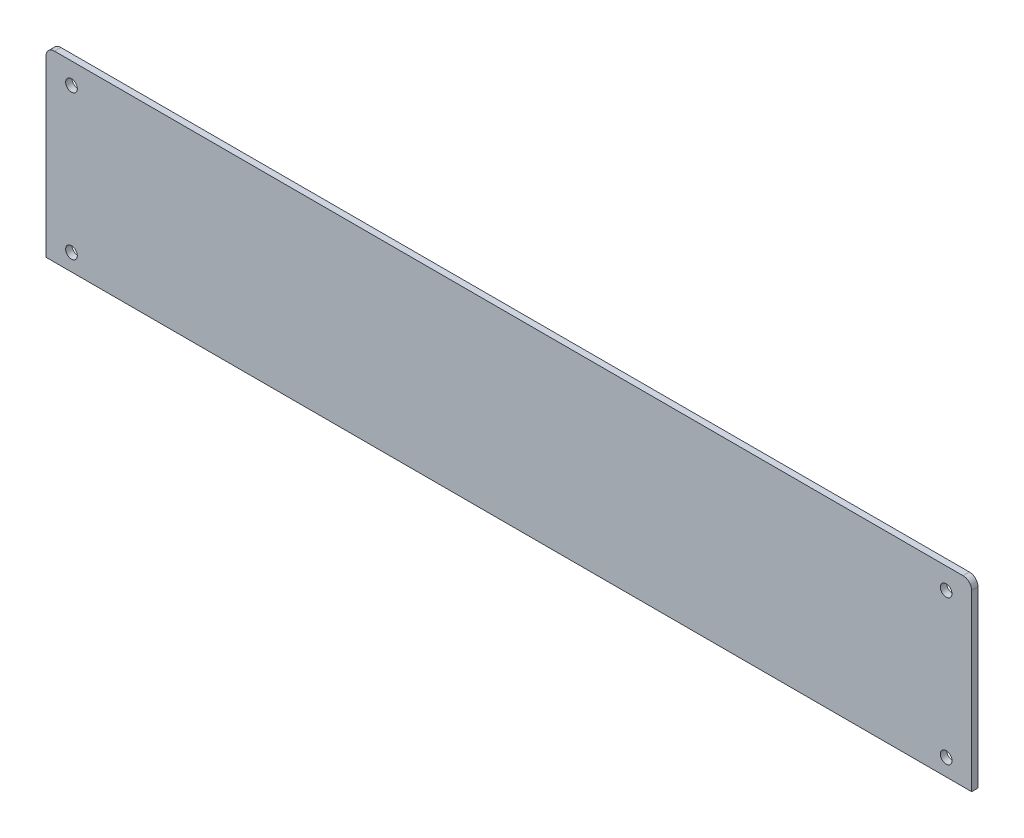
ISO-10303-21;
HEADER;
FILE_DESCRIPTION(('STEP AP214'),'2;1');
FILE_NAME('part.step','',(''),(''),'','','');
FILE_SCHEMA(('AUTOMOTIVE_DESIGN { 1 0 10303 214 1 1 1 1 }'));
ENDSEC;
DATA;
#1=APPLICATION_CONTEXT('core data for automotive mechanical design processes');
#2=APPLICATION_PROTOCOL_DEFINITION('international standard','automotive_design',2000,#1);
#3=PRODUCT_CONTEXT('',#1,'mechanical');
#4=PRODUCT('Part','Part','',(#3));
#5=PRODUCT_RELATED_PRODUCT_CATEGORY('part','',(#4));
#6=PRODUCT_DEFINITION_FORMATION('','',#4);
#7=PRODUCT_DEFINITION_CONTEXT('part definition',#1,'design');
#8=PRODUCT_DEFINITION('design','',#6,#7);
#9=PRODUCT_DEFINITION_SHAPE('','',#8);
#10=(LENGTH_UNIT() NAMED_UNIT(*) SI_UNIT(.MILLI.,.METRE.));
#11=(NAMED_UNIT(*) PLANE_ANGLE_UNIT() SI_UNIT($,.RADIAN.));
#12=(NAMED_UNIT(*) SI_UNIT($,.STERADIAN.) SOLID_ANGLE_UNIT());
#13=UNCERTAINTY_MEASURE_WITH_UNIT(LENGTH_MEASURE(1.E-05),#10,'distance_accuracy_value','');
#14=(GEOMETRIC_REPRESENTATION_CONTEXT(3) GLOBAL_UNCERTAINTY_ASSIGNED_CONTEXT((#13)) GLOBAL_UNIT_ASSIGNED_CONTEXT((#10,
#11,#12)) REPRESENTATION_CONTEXT('',''));
#15=CARTESIAN_POINT('',(0.,0.,0.));
#16=DIRECTION('',(0.,0.,1.));
#17=DIRECTION('',(1.,0.,0.));
#18=AXIS2_PLACEMENT_3D('',#15,#16,#17);
#19=CARTESIAN_POINT('',(436.,0.,3.));
#20=DIRECTION('',(-1.,0.,0.));
#21=DIRECTION('',(0.,0.,1.));
#22=AXIS2_PLACEMENT_3D('',#19,#20,#21);
#23=PLANE('',#22);
#24=DIRECTION('',(0.,1.,0.));
#25=VECTOR('',#24,1.);
#26=CARTESIAN_POINT('',(436.,0.,0.));
#27=LINE('',#26,#25);
#28=CARTESIAN_POINT('',(436.,0.,0.));
#29=VERTEX_POINT('',#28);
#30=CARTESIAN_POINT('',(436.,82.1,0.));
#31=VERTEX_POINT('',#30);
#32=EDGE_CURVE('E119',#29,#31,#27,.T.);
#33=ORIENTED_EDGE('',*,*,#32,.T.);
#34=DIRECTION('',(0.,0.,-1.));
#35=VECTOR('',#34,1.);
#36=CARTESIAN_POINT('',(436.,82.1,3.));
#37=LINE('',#36,#35);
#38=CARTESIAN_POINT('',(436.,82.1,3.));
#39=VERTEX_POINT('',#38);
#40=EDGE_CURVE('E11',#31,#39,#37,.F.);
#41=ORIENTED_EDGE('',*,*,#40,.T.);
#42=DIRECTION('',(0.,1.,0.));
#43=VECTOR('',#42,1.);
#44=CARTESIAN_POINT('',(436.,0.,3.));
#45=LINE('',#44,#43);
#46=CARTESIAN_POINT('',(436.,0.,3.));
#47=VERTEX_POINT('',#46);
#48=EDGE_CURVE('E126',#47,#39,#45,.T.);
#49=ORIENTED_EDGE('',*,*,#48,.F.);
#50=DIRECTION('',(0.,0.,-1.));
#51=VECTOR('',#50,1.);
#52=CARTESIAN_POINT('',(436.,0.,3.));
#53=LINE('',#52,#51);
#54=EDGE_CURVE('E111',#47,#29,#53,.T.);
#55=ORIENTED_EDGE('',*,*,#54,.T.);
#56=EDGE_LOOP('',(#33,#41,#49,#55));
#57=FACE_BOUND('',#56,.T.);
#58=ADVANCED_FACE('F37',(#57),#23,.F.);
#59=CARTESIAN_POINT('',(0.,86.1,3.));
#60=DIRECTION('',(0.,-1.,0.));
#61=DIRECTION('',(0.,0.,-1.));
#62=AXIS2_PLACEMENT_3D('',#59,#60,#61);
#63=PLANE('',#62);
#64=DIRECTION('',(-1.,0.,0.));
#65=VECTOR('',#64,1.);
#66=CARTESIAN_POINT('',(0.,86.1,0.));
#67=LINE('',#66,#65);
#68=CARTESIAN_POINT('',(432.,86.1,0.));
#69=VERTEX_POINT('',#68);
#70=CARTESIAN_POINT('',(4.,86.1,0.));
#71=VERTEX_POINT('',#70);
#72=EDGE_CURVE('E121',#69,#71,#67,.T.);
#73=ORIENTED_EDGE('',*,*,#72,.T.);
#74=DIRECTION('',(0.,0.,-1.));
#75=VECTOR('',#74,1.);
#76=CARTESIAN_POINT('',(4.,86.1,3.));
#77=LINE('',#76,#75);
#78=CARTESIAN_POINT('',(4.,86.1,3.));
#79=VERTEX_POINT('',#78);
#80=EDGE_CURVE('E58',#71,#79,#77,.F.);
#81=ORIENTED_EDGE('',*,*,#80,.T.);
#82=DIRECTION('',(-1.,0.,0.));
#83=VECTOR('',#82,1.);
#84=CARTESIAN_POINT('',(0.,86.1,3.));
#85=LINE('',#84,#83);
#86=CARTESIAN_POINT('',(432.,86.1,3.));
#87=VERTEX_POINT('',#86);
#88=EDGE_CURVE('E101',#87,#79,#85,.T.);
#89=ORIENTED_EDGE('',*,*,#88,.F.);
#90=DIRECTION('',(0.,0.,-1.));
#91=VECTOR('',#90,1.);
#92=CARTESIAN_POINT('',(432.,86.1,3.));
#93=LINE('',#92,#91);
#94=EDGE_CURVE('E133',#87,#69,#93,.T.);
#95=ORIENTED_EDGE('',*,*,#94,.T.);
#96=EDGE_LOOP('',(#73,#81,#89,#95));
#97=FACE_BOUND('',#96,.T.);
#98=ADVANCED_FACE('F141',(#97),#63,.F.);
#99=CARTESIAN_POINT('',(0.,0.,3.));
#100=DIRECTION('',(1.,0.,0.));
#101=DIRECTION('',(0.,0.,-1.));
#102=AXIS2_PLACEMENT_3D('',#99,#100,#101);
#103=PLANE('',#102);
#104=DIRECTION('',(0.,-1.,0.));
#105=VECTOR('',#104,1.);
#106=CARTESIAN_POINT('',(0.,0.,3.));
#107=LINE('',#106,#105);
#108=CARTESIAN_POINT('',(0.,82.1,3.));
#109=VERTEX_POINT('',#108);
#110=CARTESIAN_POINT('',(0.,0.,3.));
#111=VERTEX_POINT('',#110);
#112=EDGE_CURVE('E91',#109,#111,#107,.T.);
#113=ORIENTED_EDGE('',*,*,#112,.F.);
#114=DIRECTION('',(0.,0.,-1.));
#115=VECTOR('',#114,1.);
#116=CARTESIAN_POINT('',(0.,82.1,3.));
#117=LINE('',#116,#115);
#118=CARTESIAN_POINT('',(0.,82.1,0.));
#119=VERTEX_POINT('',#118);
#120=EDGE_CURVE('E110',#109,#119,#117,.T.);
#121=ORIENTED_EDGE('',*,*,#120,.T.);
#122=DIRECTION('',(0.,-1.,0.));
#123=VECTOR('',#122,1.);
#124=CARTESIAN_POINT('',(0.,0.,0.));
#125=LINE('',#124,#123);
#126=CARTESIAN_POINT('',(0.,0.,0.));
#127=VERTEX_POINT('',#126);
#128=EDGE_CURVE('E107',#119,#127,#125,.T.);
#129=ORIENTED_EDGE('',*,*,#128,.T.);
#130=DIRECTION('',(0.,0.,-1.));
#131=VECTOR('',#130,1.);
#132=CARTESIAN_POINT('',(0.,0.,3.));
#133=LINE('',#132,#131);
#134=EDGE_CURVE('E104',#111,#127,#133,.T.);
#135=ORIENTED_EDGE('',*,*,#134,.F.);
#136=EDGE_LOOP('',(#113,#121,#129,#135));
#137=FACE_BOUND('',#136,.T.);
#138=ADVANCED_FACE('F105',(#137),#103,.F.);
#139=CARTESIAN_POINT('',(0.,0.,3.));
#140=DIRECTION('',(0.,1.,0.));
#141=DIRECTION('',(0.,0.,1.));
#142=AXIS2_PLACEMENT_3D('',#139,#140,#141);
#143=PLANE('',#142);
#144=DIRECTION('',(1.,0.,0.));
#145=VECTOR('',#144,1.);
#146=CARTESIAN_POINT('',(0.,0.,0.));
#147=LINE('',#146,#145);
#148=EDGE_CURVE('E125',#127,#29,#147,.T.);
#149=ORIENTED_EDGE('',*,*,#148,.T.);
#150=ORIENTED_EDGE('',*,*,#54,.F.);
#151=DIRECTION('',(1.,0.,0.));
#152=VECTOR('',#151,1.);
#153=CARTESIAN_POINT('',(0.,0.,3.));
#154=LINE('',#153,#152);
#155=EDGE_CURVE('E95',#111,#47,#154,.T.);
#156=ORIENTED_EDGE('',*,*,#155,.F.);
#157=ORIENTED_EDGE('',*,*,#134,.T.);
#158=EDGE_LOOP('',(#149,#150,#156,#157));
#159=FACE_BOUND('',#158,.T.);
#160=ADVANCED_FACE('F113',(#159),#143,.F.);
#161=CARTESIAN_POINT('',(0.,0.,3.));
#162=DIRECTION('',(0.,0.,-1.));
#163=DIRECTION('',(-1.,0.,0.));
#164=AXIS2_PLACEMENT_3D('',#161,#162,#163);
#165=PLANE('',#164);
#166=CARTESIAN_POINT('',(12.0000000000002,76.1,3.));
#167=DIRECTION('',(0.,0.,-1.));
#168=DIRECTION('',(-1.,0.,0.));
#169=AXIS2_PLACEMENT_3D('',#166,#167,#168);
#170=CIRCLE('',#169,2.75);
#171=CARTESIAN_POINT('',(9.25000000000024,76.1,3.));
#172=VERTEX_POINT('',#171);
#173=EDGE_CURVE('E163',#172,#172,#170,.T.);
#174=ORIENTED_EDGE('',*,*,#173,.T.);
#175=EDGE_LOOP('',(#174));
#176=FACE_BOUND('',#175,.T.);
#177=CARTESIAN_POINT('',(424.,76.1,3.));
#178=DIRECTION('',(0.,0.,-1.));
#179=DIRECTION('',(-1.,0.,0.));
#180=AXIS2_PLACEMENT_3D('',#177,#178,#179);
#181=CIRCLE('',#180,2.74999999999998);
#182=CARTESIAN_POINT('',(421.25,76.1,3.));
#183=VERTEX_POINT('',#182);
#184=EDGE_CURVE('E157',#183,#183,#181,.T.);
#185=ORIENTED_EDGE('',*,*,#184,.T.);
#186=EDGE_LOOP('',(#185));
#187=FACE_BOUND('',#186,.T.);
#188=CARTESIAN_POINT('',(12.,7.99999999999999,3.));
#189=DIRECTION('',(0.,0.,-1.));
#190=DIRECTION('',(-1.,0.,0.));
#191=AXIS2_PLACEMENT_3D('',#188,#189,#190);
#192=CIRCLE('',#191,2.75);
#193=CARTESIAN_POINT('',(9.25,7.99999999999999,3.));
#194=VERTEX_POINT('',#193);
#195=EDGE_CURVE('E151',#194,#194,#192,.T.);
#196=ORIENTED_EDGE('',*,*,#195,.T.);
#197=EDGE_LOOP('',(#196));
#198=FACE_BOUND('',#197,.T.);
#199=CARTESIAN_POINT('',(424.,8.,3.));
#200=DIRECTION('',(0.,0.,-1.));
#201=DIRECTION('',(-1.,0.,0.));
#202=AXIS2_PLACEMENT_3D('',#199,#200,#201);
#203=CIRCLE('',#202,2.74999999999998);
#204=CARTESIAN_POINT('',(421.25,8.,3.));
#205=VERTEX_POINT('',#204);
#206=EDGE_CURVE('E122',#205,#205,#203,.T.);
#207=ORIENTED_EDGE('',*,*,#206,.T.);
#208=EDGE_LOOP('',(#207));
#209=FACE_BOUND('',#208,.T.);
#210=ORIENTED_EDGE('',*,*,#88,.T.);
#211=CARTESIAN_POINT('',(4.,82.1,3.));
#212=DIRECTION('',(0.,0.,-1.));
#213=DIRECTION('',(-1.,0.,0.));
#214=AXIS2_PLACEMENT_3D('',#211,#212,#213);
#215=CIRCLE('',#214,4.);
#216=EDGE_CURVE('E45',#79,#109,#215,.F.);
#217=ORIENTED_EDGE('',*,*,#216,.T.);
#218=ORIENTED_EDGE('',*,*,#112,.T.);
#219=ORIENTED_EDGE('',*,*,#155,.T.);
#220=ORIENTED_EDGE('',*,*,#48,.T.);
#221=CARTESIAN_POINT('',(432.,82.1,3.));
#222=DIRECTION('',(0.,0.,-1.));
#223=DIRECTION('',(-1.,0.,0.));
#224=AXIS2_PLACEMENT_3D('',#221,#222,#223);
#225=CIRCLE('',#224,4.);
#226=EDGE_CURVE('E137',#39,#87,#225,.F.);
#227=ORIENTED_EDGE('',*,*,#226,.T.);
#228=EDGE_LOOP('',(#210,#217,#218,#219,#220,#227));
#229=FACE_BOUND('',#228,.T.);
#230=ADVANCED_FACE('F93',(#176,#187,#198,#209,#229),#165,.F.);
#231=CARTESIAN_POINT('',(0.,0.,0.));
#232=DIRECTION('',(0.,0.,-1.));
#233=DIRECTION('',(-1.,0.,0.));
#234=AXIS2_PLACEMENT_3D('',#231,#232,#233);
#235=PLANE('',#234);
#236=CARTESIAN_POINT('',(12.0000000000002,76.1,0.));
#237=DIRECTION('',(0.,0.,-1.));
#238=DIRECTION('',(-1.,0.,0.));
#239=AXIS2_PLACEMENT_3D('',#236,#237,#238);
#240=CIRCLE('',#239,2.75);
#241=CARTESIAN_POINT('',(9.25000000000024,76.1,0.));
#242=VERTEX_POINT('',#241);
#243=EDGE_CURVE('E166',#242,#242,#240,.T.);
#244=ORIENTED_EDGE('',*,*,#243,.F.);
#245=EDGE_LOOP('',(#244));
#246=FACE_BOUND('',#245,.T.);
#247=CARTESIAN_POINT('',(424.,76.1,0.));
#248=DIRECTION('',(0.,0.,-1.));
#249=DIRECTION('',(-1.,0.,0.));
#250=AXIS2_PLACEMENT_3D('',#247,#248,#249);
#251=CIRCLE('',#250,2.74999999999998);
#252=CARTESIAN_POINT('',(421.25,76.1,0.));
#253=VERTEX_POINT('',#252);
#254=EDGE_CURVE('E160',#253,#253,#251,.T.);
#255=ORIENTED_EDGE('',*,*,#254,.F.);
#256=EDGE_LOOP('',(#255));
#257=FACE_BOUND('',#256,.T.);
#258=CARTESIAN_POINT('',(12.,7.99999999999999,0.));
#259=DIRECTION('',(0.,0.,-1.));
#260=DIRECTION('',(-1.,0.,0.));
#261=AXIS2_PLACEMENT_3D('',#258,#259,#260);
#262=CIRCLE('',#261,2.75);
#263=CARTESIAN_POINT('',(9.25,7.99999999999999,0.));
#264=VERTEX_POINT('',#263);
#265=EDGE_CURVE('E154',#264,#264,#262,.T.);
#266=ORIENTED_EDGE('',*,*,#265,.F.);
#267=EDGE_LOOP('',(#266));
#268=FACE_BOUND('',#267,.T.);
#269=CARTESIAN_POINT('',(424.,8.,0.));
#270=DIRECTION('',(0.,0.,-1.));
#271=DIRECTION('',(-1.,0.,0.));
#272=AXIS2_PLACEMENT_3D('',#269,#270,#271);
#273=CIRCLE('',#272,2.74999999999998);
#274=CARTESIAN_POINT('',(421.25,8.,0.));
#275=VERTEX_POINT('',#274);
#276=EDGE_CURVE('E148',#275,#275,#273,.T.);
#277=ORIENTED_EDGE('',*,*,#276,.F.);
#278=EDGE_LOOP('',(#277));
#279=FACE_BOUND('',#278,.T.);
#280=ORIENTED_EDGE('',*,*,#128,.F.);
#281=CARTESIAN_POINT('',(4.,82.1,0.));
#282=DIRECTION('',(0.,0.,-1.));
#283=DIRECTION('',(-1.,0.,0.));
#284=AXIS2_PLACEMENT_3D('',#281,#282,#283);
#285=CIRCLE('',#284,4.);
#286=EDGE_CURVE('E131',#119,#71,#285,.T.);
#287=ORIENTED_EDGE('',*,*,#286,.T.);
#288=ORIENTED_EDGE('',*,*,#72,.F.);
#289=CARTESIAN_POINT('',(432.,82.1,0.));
#290=DIRECTION('',(0.,0.,-1.));
#291=DIRECTION('',(-1.,0.,0.));
#292=AXIS2_PLACEMENT_3D('',#289,#290,#291);
#293=CIRCLE('',#292,4.);
#294=EDGE_CURVE('E129',#69,#31,#293,.T.);
#295=ORIENTED_EDGE('',*,*,#294,.T.);
#296=ORIENTED_EDGE('',*,*,#32,.F.);
#297=ORIENTED_EDGE('',*,*,#148,.F.);
#298=EDGE_LOOP('',(#280,#287,#288,#295,#296,#297));
#299=FACE_BOUND('',#298,.T.);
#300=ADVANCED_FACE('F145',(#246,#257,#268,#279,#299),#235,.T.);
#301=CARTESIAN_POINT('',(424.,8.,3.));
#302=DIRECTION('',(0.,0.,-1.));
#303=DIRECTION('',(-1.,0.,0.));
#304=AXIS2_PLACEMENT_3D('',#301,#302,#303);
#305=CYLINDRICAL_SURFACE('',#304,2.74999999999998);
#306=ORIENTED_EDGE('',*,*,#206,.F.);
#307=EDGE_LOOP('',(#306));
#308=FACE_BOUND('',#307,.T.);
#309=ORIENTED_EDGE('',*,*,#276,.T.);
#310=EDGE_LOOP('',(#309));
#311=FACE_BOUND('',#310,.T.);
#312=ADVANCED_FACE('F184',(#308,#311),#305,.F.);
#313=CARTESIAN_POINT('',(12.,7.99999999999999,3.));
#314=DIRECTION('',(0.,0.,-1.));
#315=DIRECTION('',(-1.,0.,0.));
#316=AXIS2_PLACEMENT_3D('',#313,#314,#315);
#317=CYLINDRICAL_SURFACE('',#316,2.75);
#318=ORIENTED_EDGE('',*,*,#195,.F.);
#319=EDGE_LOOP('',(#318));
#320=FACE_BOUND('',#319,.T.);
#321=ORIENTED_EDGE('',*,*,#265,.T.);
#322=EDGE_LOOP('',(#321));
#323=FACE_BOUND('',#322,.T.);
#324=ADVANCED_FACE('F193',(#320,#323),#317,.F.);
#325=CARTESIAN_POINT('',(424.,76.1,3.));
#326=DIRECTION('',(0.,0.,-1.));
#327=DIRECTION('',(-1.,0.,0.));
#328=AXIS2_PLACEMENT_3D('',#325,#326,#327);
#329=CYLINDRICAL_SURFACE('',#328,2.74999999999998);
#330=ORIENTED_EDGE('',*,*,#184,.F.);
#331=EDGE_LOOP('',(#330));
#332=FACE_BOUND('',#331,.T.);
#333=ORIENTED_EDGE('',*,*,#254,.T.);
#334=EDGE_LOOP('',(#333));
#335=FACE_BOUND('',#334,.T.);
#336=ADVANCED_FACE('F178',(#332,#335),#329,.F.);
#337=CARTESIAN_POINT('',(12.0000000000002,76.1,3.));
#338=DIRECTION('',(0.,0.,-1.));
#339=DIRECTION('',(-1.,0.,0.));
#340=AXIS2_PLACEMENT_3D('',#337,#338,#339);
#341=CYLINDRICAL_SURFACE('',#340,2.75);
#342=ORIENTED_EDGE('',*,*,#173,.F.);
#343=EDGE_LOOP('',(#342));
#344=FACE_BOUND('',#343,.T.);
#345=ORIENTED_EDGE('',*,*,#243,.T.);
#346=EDGE_LOOP('',(#345));
#347=FACE_BOUND('',#346,.T.);
#348=ADVANCED_FACE('F174',(#344,#347),#341,.F.);
#349=CARTESIAN_POINT('',(4.,82.1,3.));
#350=DIRECTION('',(0.,0.,-1.));
#351=DIRECTION('',(-1.,0.,0.));
#352=AXIS2_PLACEMENT_3D('',#349,#350,#351);
#353=CYLINDRICAL_SURFACE('',#352,4.);
#354=ORIENTED_EDGE('',*,*,#216,.F.);
#355=ORIENTED_EDGE('',*,*,#80,.F.);
#356=ORIENTED_EDGE('',*,*,#286,.F.);
#357=ORIENTED_EDGE('',*,*,#120,.F.);
#358=EDGE_LOOP('',(#354,#355,#356,#357));
#359=FACE_BOUND('',#358,.T.);
#360=ADVANCED_FACE('F177',(#359),#353,.T.);
#361=CARTESIAN_POINT('',(432.,82.1,3.));
#362=DIRECTION('',(0.,0.,-1.));
#363=DIRECTION('',(-1.,0.,0.));
#364=AXIS2_PLACEMENT_3D('',#361,#362,#363);
#365=CYLINDRICAL_SURFACE('',#364,4.);
#366=ORIENTED_EDGE('',*,*,#226,.F.);
#367=ORIENTED_EDGE('',*,*,#40,.F.);
#368=ORIENTED_EDGE('',*,*,#294,.F.);
#369=ORIENTED_EDGE('',*,*,#94,.F.);
#370=EDGE_LOOP('',(#366,#367,#368,#369));
#371=FACE_BOUND('',#370,.T.);
#372=ADVANCED_FACE('F39',(#371),#365,.T.);
#373=CLOSED_SHELL('',(#58,#98,#138,#160,#230,#300,#312,#324,#336,#348,#360,#372));
#374=MANIFOLD_SOLID_BREP('B2',#373);
#375=ADVANCED_BREP_SHAPE_REPRESENTATION('',(#18,#374),#14);
#376=SHAPE_DEFINITION_REPRESENTATION(#9,#375);
ENDSEC;
END-ISO-10303-21;
